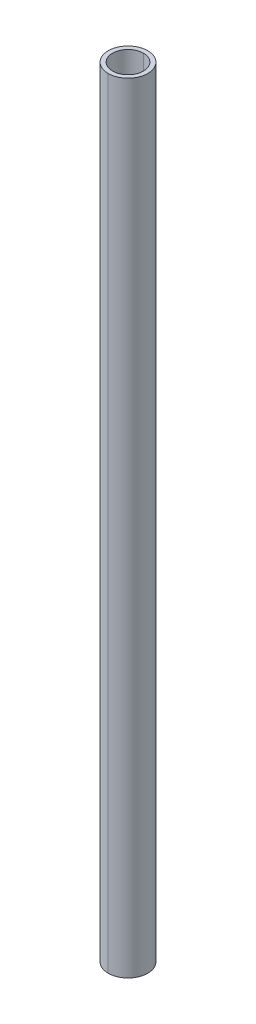
ISO-10303-21;
HEADER;
FILE_DESCRIPTION(('STEP AP214'),'2;1');
FILE_NAME('part.step','',(''),(''),'','','');
FILE_SCHEMA(('AUTOMOTIVE_DESIGN { 1 0 10303 214 1 1 1 1 }'));
ENDSEC;
DATA;
#1=APPLICATION_CONTEXT('core data for automotive mechanical design processes');
#2=APPLICATION_PROTOCOL_DEFINITION('international standard','automotive_design',2000,#1);
#3=PRODUCT_CONTEXT('',#1,'mechanical');
#4=PRODUCT('Part','Part','',(#3));
#5=PRODUCT_RELATED_PRODUCT_CATEGORY('part','',(#4));
#6=PRODUCT_DEFINITION_FORMATION('','',#4);
#7=PRODUCT_DEFINITION_CONTEXT('part definition',#1,'design');
#8=PRODUCT_DEFINITION('design','',#6,#7);
#9=PRODUCT_DEFINITION_SHAPE('','',#8);
#10=(LENGTH_UNIT() NAMED_UNIT(*) SI_UNIT(.MILLI.,.METRE.));
#11=(NAMED_UNIT(*) PLANE_ANGLE_UNIT() SI_UNIT($,.RADIAN.));
#12=(NAMED_UNIT(*) SI_UNIT($,.STERADIAN.) SOLID_ANGLE_UNIT());
#13=UNCERTAINTY_MEASURE_WITH_UNIT(LENGTH_MEASURE(1.E-05),#10,'distance_accuracy_value','');
#14=(GEOMETRIC_REPRESENTATION_CONTEXT(3) GLOBAL_UNCERTAINTY_ASSIGNED_CONTEXT((#13)) GLOBAL_UNIT_ASSIGNED_CONTEXT((#10,
#11,#12)) REPRESENTATION_CONTEXT('',''));
#15=CARTESIAN_POINT('',(0.,0.,0.));
#16=DIRECTION('',(0.,0.,1.));
#17=DIRECTION('',(1.,0.,0.));
#18=AXIS2_PLACEMENT_3D('',#15,#16,#17);
#19=CARTESIAN_POINT('',(0.,420.,0.));
#20=DIRECTION('',(0.,-1.,0.));
#21=DIRECTION('',(0.,0.,-1.));
#22=AXIS2_PLACEMENT_3D('',#19,#20,#21);
#23=CYLINDRICAL_SURFACE('',#22,10.65);
#24=CARTESIAN_POINT('',(0.,420.,0.));
#25=DIRECTION('',(0.,1.,0.));
#26=DIRECTION('',(0.,0.,1.));
#27=AXIS2_PLACEMENT_3D('',#24,#25,#26);
#28=CIRCLE('',#27,10.65);
#29=CARTESIAN_POINT('',(0.,420.,10.65));
#30=VERTEX_POINT('',#29);
#31=CARTESIAN_POINT('',(0.,420.,-10.65));
#32=VERTEX_POINT('',#31);
#33=EDGE_CURVE('E41',#30,#32,#28,.T.);
#34=ORIENTED_EDGE('',*,*,#33,.F.);
#35=DIRECTION('',(0.,-1.,0.));
#36=VECTOR('',#35,1.);
#37=CARTESIAN_POINT('',(0.,420.,10.65));
#38=LINE('',#37,#36);
#39=CARTESIAN_POINT('',(0.,0.,10.65));
#40=VERTEX_POINT('',#39);
#41=EDGE_CURVE('E11',#30,#40,#38,.T.);
#42=ORIENTED_EDGE('',*,*,#41,.T.);
#43=CARTESIAN_POINT('',(0.,0.,0.));
#44=DIRECTION('',(0.,1.,0.));
#45=DIRECTION('',(0.,0.,1.));
#46=AXIS2_PLACEMENT_3D('',#43,#44,#45);
#47=CIRCLE('',#46,10.65);
#48=CARTESIAN_POINT('',(0.,0.,-10.65));
#49=VERTEX_POINT('',#48);
#50=EDGE_CURVE('E27',#40,#49,#47,.T.);
#51=ORIENTED_EDGE('',*,*,#50,.T.);
#52=DIRECTION('',(0.,-1.,0.));
#53=VECTOR('',#52,1.);
#54=CARTESIAN_POINT('',(0.,420.,-10.65));
#55=LINE('',#54,#53);
#56=EDGE_CURVE('E57',#32,#49,#55,.T.);
#57=ORIENTED_EDGE('',*,*,#56,.F.);
#58=EDGE_LOOP('',(#34,#42,#51,#57));
#59=FACE_BOUND('',#58,.T.);
#60=ADVANCED_FACE('F16',(#59),#23,.T.);
#61=CARTESIAN_POINT('',(0.,420.,0.));
#62=DIRECTION('',(0.,-1.,0.));
#63=DIRECTION('',(0.,0.,-1.));
#64=AXIS2_PLACEMENT_3D('',#61,#62,#63);
#65=CYLINDRICAL_SURFACE('',#64,8.35);
#66=CARTESIAN_POINT('',(0.,420.,0.));
#67=DIRECTION('',(0.,1.,0.));
#68=DIRECTION('',(0.,0.,1.));
#69=AXIS2_PLACEMENT_3D('',#66,#67,#68);
#70=CIRCLE('',#69,8.35);
#71=CARTESIAN_POINT('',(0.,420.,-8.35));
#72=VERTEX_POINT('',#71);
#73=CARTESIAN_POINT('',(0.,420.,8.35));
#74=VERTEX_POINT('',#73);
#75=EDGE_CURVE('E97',#72,#74,#70,.T.);
#76=ORIENTED_EDGE('',*,*,#75,.T.);
#77=DIRECTION('',(0.,-1.,0.));
#78=VECTOR('',#77,1.);
#79=CARTESIAN_POINT('',(0.,420.,8.35));
#80=LINE('',#79,#78);
#81=CARTESIAN_POINT('',(0.,0.,8.35));
#82=VERTEX_POINT('',#81);
#83=EDGE_CURVE('E20',#74,#82,#80,.T.);
#84=ORIENTED_EDGE('',*,*,#83,.T.);
#85=CARTESIAN_POINT('',(0.,0.,0.));
#86=DIRECTION('',(0.,1.,0.));
#87=DIRECTION('',(0.,0.,1.));
#88=AXIS2_PLACEMENT_3D('',#85,#86,#87);
#89=CIRCLE('',#88,8.35);
#90=CARTESIAN_POINT('',(0.,0.,-8.35));
#91=VERTEX_POINT('',#90);
#92=EDGE_CURVE('E86',#91,#82,#89,.T.);
#93=ORIENTED_EDGE('',*,*,#92,.F.);
#94=DIRECTION('',(0.,-1.,0.));
#95=VECTOR('',#94,1.);
#96=CARTESIAN_POINT('',(0.,420.,-8.35));
#97=LINE('',#96,#95);
#98=EDGE_CURVE('E79',#72,#91,#97,.T.);
#99=ORIENTED_EDGE('',*,*,#98,.F.);
#100=EDGE_LOOP('',(#76,#84,#93,#99));
#101=FACE_BOUND('',#100,.T.);
#102=ADVANCED_FACE('F96',(#101),#65,.F.);
#103=CARTESIAN_POINT('',(0.,420.,0.));
#104=DIRECTION('',(0.,-1.,0.));
#105=DIRECTION('',(0.,0.,-1.));
#106=AXIS2_PLACEMENT_3D('',#103,#104,#105);
#107=CYLINDRICAL_SURFACE('',#106,8.35);
#108=ORIENTED_EDGE('',*,*,#83,.F.);
#109=CARTESIAN_POINT('',(0.,420.,0.));
#110=DIRECTION('',(0.,1.,0.));
#111=DIRECTION('',(0.,0.,1.));
#112=AXIS2_PLACEMENT_3D('',#109,#110,#111);
#113=CIRCLE('',#112,8.35);
#114=EDGE_CURVE('E102',#74,#72,#113,.T.);
#115=ORIENTED_EDGE('',*,*,#114,.T.);
#116=ORIENTED_EDGE('',*,*,#98,.T.);
#117=CARTESIAN_POINT('',(0.,0.,0.));
#118=DIRECTION('',(0.,1.,0.));
#119=DIRECTION('',(0.,0.,1.));
#120=AXIS2_PLACEMENT_3D('',#117,#118,#119);
#121=CIRCLE('',#120,8.35);
#122=EDGE_CURVE('E93',#82,#91,#121,.T.);
#123=ORIENTED_EDGE('',*,*,#122,.F.);
#124=EDGE_LOOP('',(#108,#115,#116,#123));
#125=FACE_BOUND('',#124,.T.);
#126=ADVANCED_FACE('F103',(#125),#107,.F.);
#127=CARTESIAN_POINT('',(0.,420.,0.));
#128=DIRECTION('',(0.,-1.,0.));
#129=DIRECTION('',(0.,0.,-1.));
#130=AXIS2_PLACEMENT_3D('',#127,#128,#129);
#131=CYLINDRICAL_SURFACE('',#130,10.65);
#132=ORIENTED_EDGE('',*,*,#41,.F.);
#133=CARTESIAN_POINT('',(0.,420.,0.));
#134=DIRECTION('',(0.,1.,0.));
#135=DIRECTION('',(0.,0.,1.));
#136=AXIS2_PLACEMENT_3D('',#133,#134,#135);
#137=CIRCLE('',#136,10.65);
#138=EDGE_CURVE('E121',#32,#30,#137,.T.);
#139=ORIENTED_EDGE('',*,*,#138,.F.);
#140=ORIENTED_EDGE('',*,*,#56,.T.);
#141=CARTESIAN_POINT('',(0.,0.,0.));
#142=DIRECTION('',(0.,1.,0.));
#143=DIRECTION('',(0.,0.,1.));
#144=AXIS2_PLACEMENT_3D('',#141,#142,#143);
#145=CIRCLE('',#144,10.65);
#146=EDGE_CURVE('E116',#49,#40,#145,.T.);
#147=ORIENTED_EDGE('',*,*,#146,.T.);
#148=EDGE_LOOP('',(#132,#139,#140,#147));
#149=FACE_BOUND('',#148,.T.);
#150=ADVANCED_FACE('F18',(#149),#131,.T.);
#151=CARTESIAN_POINT('',(0.,420.,0.));
#152=DIRECTION('',(0.,1.,0.));
#153=DIRECTION('',(1.,0.,0.));
#154=AXIS2_PLACEMENT_3D('',#151,#152,#153);
#155=PLANE('',#154);
#156=ORIENTED_EDGE('',*,*,#138,.T.);
#157=ORIENTED_EDGE('',*,*,#33,.T.);
#158=EDGE_LOOP('',(#156,#157));
#159=FACE_BOUND('',#158,.T.);
#160=ORIENTED_EDGE('',*,*,#75,.F.);
#161=ORIENTED_EDGE('',*,*,#114,.F.);
#162=EDGE_LOOP('',(#160,#161));
#163=FACE_BOUND('',#162,.T.);
#164=ADVANCED_FACE('F204',(#159,#163),#155,.T.);
#165=CARTESIAN_POINT('',(0.,0.,0.));
#166=DIRECTION('',(0.,1.,0.));
#167=DIRECTION('',(1.,0.,0.));
#168=AXIS2_PLACEMENT_3D('',#165,#166,#167);
#169=PLANE('',#168);
#170=ORIENTED_EDGE('',*,*,#146,.F.);
#171=ORIENTED_EDGE('',*,*,#50,.F.);
#172=EDGE_LOOP('',(#170,#171));
#173=FACE_BOUND('',#172,.T.);
#174=ORIENTED_EDGE('',*,*,#92,.T.);
#175=ORIENTED_EDGE('',*,*,#122,.T.);
#176=EDGE_LOOP('',(#174,#175));
#177=FACE_BOUND('',#176,.T.);
#178=ADVANCED_FACE('F91',(#173,#177),#169,.F.);
#179=CLOSED_SHELL('',(#60,#102,#126,#150,#164,#178));
#180=MANIFOLD_SOLID_BREP('B1',#179);
#181=ADVANCED_BREP_SHAPE_REPRESENTATION('',(#18,#180),#14);
#182=SHAPE_DEFINITION_REPRESENTATION(#9,#181);
ENDSEC;
END-ISO-10303-21;
